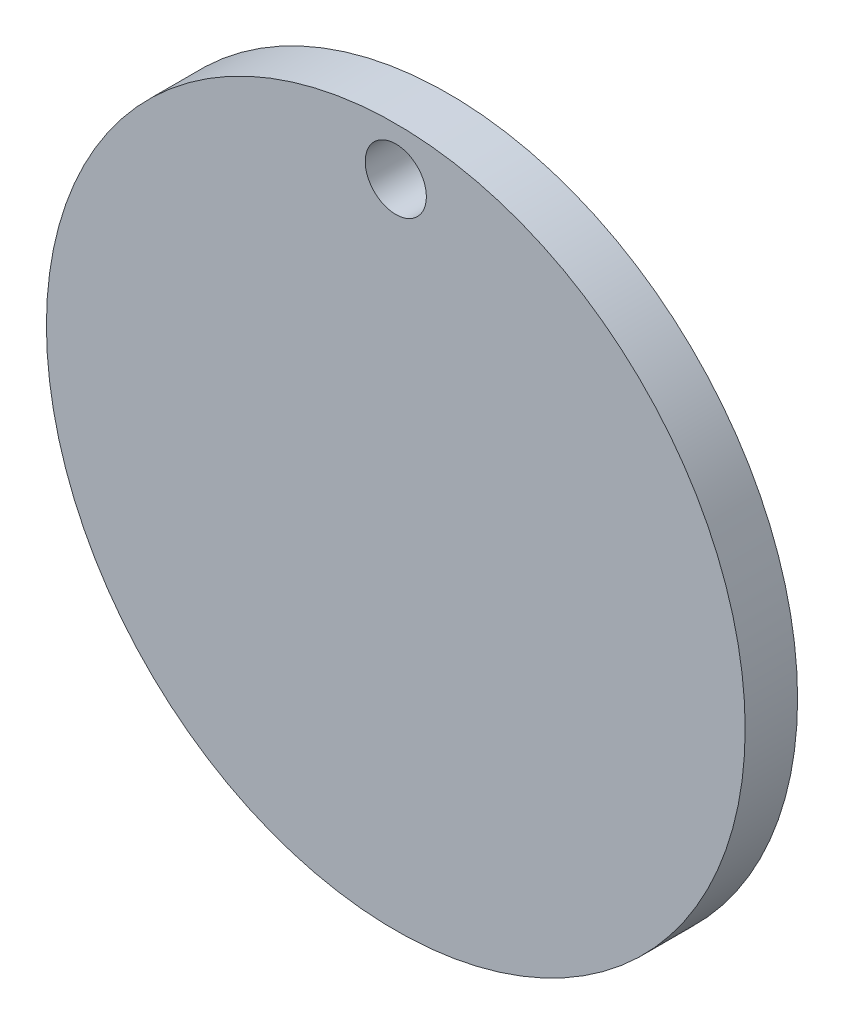
ISO-10303-21;
HEADER;
FILE_DESCRIPTION(('STEP AP214'),'2;1');
FILE_NAME('part.step','',(''),(''),'','','');
FILE_SCHEMA(('AUTOMOTIVE_DESIGN { 1 0 10303 214 1 1 1 1 }'));
ENDSEC;
DATA;
#1=APPLICATION_CONTEXT('core data for automotive mechanical design processes');
#2=APPLICATION_PROTOCOL_DEFINITION('international standard','automotive_design',2000,#1);
#3=PRODUCT_CONTEXT('',#1,'mechanical');
#4=PRODUCT('Part','Part','',(#3));
#5=PRODUCT_RELATED_PRODUCT_CATEGORY('part','',(#4));
#6=PRODUCT_DEFINITION_FORMATION('','',#4);
#7=PRODUCT_DEFINITION_CONTEXT('part definition',#1,'design');
#8=PRODUCT_DEFINITION('design','',#6,#7);
#9=PRODUCT_DEFINITION_SHAPE('','',#8);
#10=(LENGTH_UNIT() NAMED_UNIT(*) SI_UNIT(.MILLI.,.METRE.));
#11=(NAMED_UNIT(*) PLANE_ANGLE_UNIT() SI_UNIT($,.RADIAN.));
#12=(NAMED_UNIT(*) SI_UNIT($,.STERADIAN.) SOLID_ANGLE_UNIT());
#13=UNCERTAINTY_MEASURE_WITH_UNIT(LENGTH_MEASURE(1.E-05),#10,'distance_accuracy_value','');
#14=(GEOMETRIC_REPRESENTATION_CONTEXT(3) GLOBAL_UNCERTAINTY_ASSIGNED_CONTEXT((#13)) GLOBAL_UNIT_ASSIGNED_CONTEXT((#10,
#11,#12)) REPRESENTATION_CONTEXT('',''));
#15=CARTESIAN_POINT('',(0.,0.,0.));
#16=DIRECTION('',(0.,0.,1.));
#17=DIRECTION('',(1.,0.,0.));
#18=AXIS2_PLACEMENT_3D('',#15,#16,#17);
#19=CARTESIAN_POINT('',(0.,0.,3.));
#20=DIRECTION('',(0.,0.,-1.));
#21=DIRECTION('',(-1.,0.,0.));
#22=AXIS2_PLACEMENT_3D('',#19,#20,#21);
#23=CYLINDRICAL_SURFACE('',#22,20.);
#24=CARTESIAN_POINT('',(0.,0.,3.));
#25=DIRECTION('',(0.,0.,1.));
#26=DIRECTION('',(1.,0.,0.));
#27=AXIS2_PLACEMENT_3D('',#24,#25,#26);
#28=CIRCLE('',#27,20.);
#29=CARTESIAN_POINT('',(20.,0.,3.));
#30=VERTEX_POINT('',#29);
#31=EDGE_CURVE('E10',#30,#30,#28,.T.);
#32=ORIENTED_EDGE('',*,*,#31,.F.);
#33=EDGE_LOOP('',(#32));
#34=FACE_BOUND('',#33,.T.);
#35=CARTESIAN_POINT('',(0.,0.,0.));
#36=DIRECTION('',(0.,0.,1.));
#37=DIRECTION('',(1.,0.,0.));
#38=AXIS2_PLACEMENT_3D('',#35,#36,#37);
#39=CIRCLE('',#38,20.);
#40=CARTESIAN_POINT('',(20.,0.,0.));
#41=VERTEX_POINT('',#40);
#42=EDGE_CURVE('E41',#41,#41,#39,.T.);
#43=ORIENTED_EDGE('',*,*,#42,.T.);
#44=EDGE_LOOP('',(#43));
#45=FACE_BOUND('',#44,.T.);
#46=ADVANCED_FACE('F38',(#34,#45),#23,.T.);
#47=CARTESIAN_POINT('',(0.,0.,3.));
#48=DIRECTION('',(0.,0.,1.));
#49=DIRECTION('',(1.,0.,0.));
#50=AXIS2_PLACEMENT_3D('',#47,#48,#49);
#51=PLANE('',#50);
#52=CARTESIAN_POINT('',(0.,17.25,3.));
#53=DIRECTION('',(0.,0.,1.));
#54=DIRECTION('',(1.,0.,0.));
#55=AXIS2_PLACEMENT_3D('',#52,#53,#54);
#56=CIRCLE('',#55,1.75);
#57=CARTESIAN_POINT('',(1.75,17.25,3.));
#58=VERTEX_POINT('',#57);
#59=EDGE_CURVE('E50',#58,#58,#56,.T.);
#60=ORIENTED_EDGE('',*,*,#59,.F.);
#61=EDGE_LOOP('',(#60));
#62=FACE_BOUND('',#61,.T.);
#63=ORIENTED_EDGE('',*,*,#31,.T.);
#64=EDGE_LOOP('',(#63));
#65=FACE_BOUND('',#64,.T.);
#66=ADVANCED_FACE('F65',(#62,#65),#51,.T.);
#67=CARTESIAN_POINT('',(0.,0.,0.));
#68=DIRECTION('',(0.,0.,1.));
#69=DIRECTION('',(1.,0.,0.));
#70=AXIS2_PLACEMENT_3D('',#67,#68,#69);
#71=PLANE('',#70);
#72=CARTESIAN_POINT('',(0.,17.25,0.));
#73=DIRECTION('',(0.,0.,1.));
#74=DIRECTION('',(1.,0.,0.));
#75=AXIS2_PLACEMENT_3D('',#72,#73,#74);
#76=CIRCLE('',#75,1.75);
#77=CARTESIAN_POINT('',(1.75,17.25,0.));
#78=VERTEX_POINT('',#77);
#79=EDGE_CURVE('E48',#78,#78,#76,.T.);
#80=ORIENTED_EDGE('',*,*,#79,.T.);
#81=EDGE_LOOP('',(#80));
#82=FACE_BOUND('',#81,.T.);
#83=ORIENTED_EDGE('',*,*,#42,.F.);
#84=EDGE_LOOP('',(#83));
#85=FACE_BOUND('',#84,.T.);
#86=ADVANCED_FACE('F56',(#82,#85),#71,.F.);
#87=CARTESIAN_POINT('',(0.,17.25,0.));
#88=DIRECTION('',(0.,0.,1.));
#89=DIRECTION('',(1.,0.,0.));
#90=AXIS2_PLACEMENT_3D('',#87,#88,#89);
#91=CYLINDRICAL_SURFACE('',#90,1.75);
#92=ORIENTED_EDGE('',*,*,#79,.F.);
#93=EDGE_LOOP('',(#92));
#94=FACE_BOUND('',#93,.T.);
#95=ORIENTED_EDGE('',*,*,#59,.T.);
#96=EDGE_LOOP('',(#95));
#97=FACE_BOUND('',#96,.T.);
#98=ADVANCED_FACE('F59',(#94,#97),#91,.F.);
#99=CLOSED_SHELL('',(#46,#66,#86,#98));
#100=MANIFOLD_SOLID_BREP('B2',#99);
#101=ADVANCED_BREP_SHAPE_REPRESENTATION('',(#18,#100),#14);
#102=SHAPE_DEFINITION_REPRESENTATION(#9,#101);
ENDSEC;
END-ISO-10303-21;
